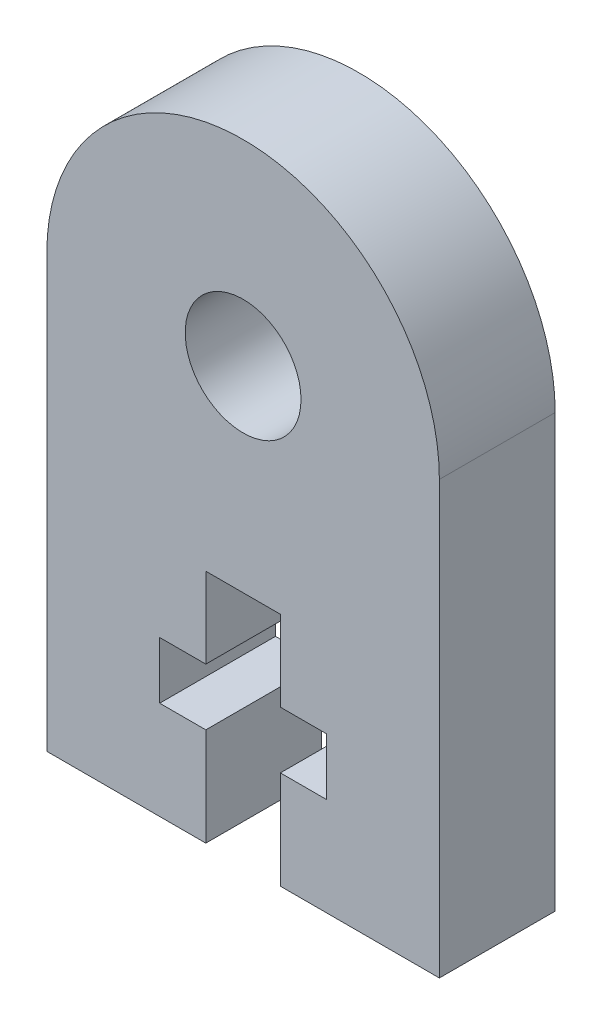
ISO-10303-21;
HEADER;
FILE_DESCRIPTION(('STEP AP214'),'2;1');
FILE_NAME('part.step','',(''),(''),'','','');
FILE_SCHEMA(('AUTOMOTIVE_DESIGN { 1 0 10303 214 1 1 1 1 }'));
ENDSEC;
DATA;
#1=APPLICATION_CONTEXT('core data for automotive mechanical design processes');
#2=APPLICATION_PROTOCOL_DEFINITION('international standard','automotive_design',2000,#1);
#3=PRODUCT_CONTEXT('',#1,'mechanical');
#4=PRODUCT('Part','Part','',(#3));
#5=PRODUCT_RELATED_PRODUCT_CATEGORY('part','',(#4));
#6=PRODUCT_DEFINITION_FORMATION('','',#4);
#7=PRODUCT_DEFINITION_CONTEXT('part definition',#1,'design');
#8=PRODUCT_DEFINITION('design','',#6,#7);
#9=PRODUCT_DEFINITION_SHAPE('','',#8);
#10=(LENGTH_UNIT() NAMED_UNIT(*) SI_UNIT(.MILLI.,.METRE.));
#11=(NAMED_UNIT(*) PLANE_ANGLE_UNIT() SI_UNIT($,.RADIAN.));
#12=(NAMED_UNIT(*) SI_UNIT($,.STERADIAN.) SOLID_ANGLE_UNIT());
#13=UNCERTAINTY_MEASURE_WITH_UNIT(LENGTH_MEASURE(1.E-05),#10,'distance_accuracy_value','');
#14=(GEOMETRIC_REPRESENTATION_CONTEXT(3) GLOBAL_UNCERTAINTY_ASSIGNED_CONTEXT((#13)) GLOBAL_UNIT_ASSIGNED_CONTEXT((#10,
#11,#12)) REPRESENTATION_CONTEXT('',''));
#15=CARTESIAN_POINT('',(0.,0.,0.));
#16=DIRECTION('',(0.,0.,1.));
#17=DIRECTION('',(1.,0.,0.));
#18=AXIS2_PLACEMENT_3D('',#15,#16,#17);
#19=CARTESIAN_POINT('',(-10.,-22.,5.9));
#20=DIRECTION('',(0.,1.,0.));
#21=DIRECTION('',(-1.,0.,0.));
#22=AXIS2_PLACEMENT_3D('',#19,#20,#21);
#23=PLANE('',#22);
#24=DIRECTION('',(1.,0.,0.));
#25=VECTOR('',#24,1.);
#26=CARTESIAN_POINT('',(-10.,-22.,0.));
#27=LINE('',#26,#25);
#28=CARTESIAN_POINT('',(-10.,-22.,0.));
#29=VERTEX_POINT('',#28);
#30=CARTESIAN_POINT('',(-1.90000000000001,-22.,0.));
#31=VERTEX_POINT('',#30);
#32=EDGE_CURVE('E173',#29,#31,#27,.T.);
#33=ORIENTED_EDGE('',*,*,#32,.T.);
#34=DIRECTION('',(0.,0.,1.));
#35=VECTOR('',#34,1.);
#36=CARTESIAN_POINT('',(-1.90000000000001,-22.,0.));
#37=LINE('',#36,#35);
#38=CARTESIAN_POINT('',(-1.90000000000001,-22.,5.9));
#39=VERTEX_POINT('',#38);
#40=EDGE_CURVE('E156',#31,#39,#37,.T.);
#41=ORIENTED_EDGE('',*,*,#40,.T.);
#42=DIRECTION('',(1.,0.,0.));
#43=VECTOR('',#42,1.);
#44=CARTESIAN_POINT('',(-10.,-22.,5.9));
#45=LINE('',#44,#43);
#46=CARTESIAN_POINT('',(-10.,-22.,5.9));
#47=VERTEX_POINT('',#46);
#48=EDGE_CURVE('E220',#47,#39,#45,.T.);
#49=ORIENTED_EDGE('',*,*,#48,.F.);
#50=DIRECTION('',(0.,0.,-1.));
#51=VECTOR('',#50,1.);
#52=CARTESIAN_POINT('',(-10.,-22.,5.9));
#53=LINE('',#52,#51);
#54=EDGE_CURVE('E178',#47,#29,#53,.T.);
#55=ORIENTED_EDGE('',*,*,#54,.T.);
#56=EDGE_LOOP('',(#33,#41,#49,#55));
#57=FACE_BOUND('',#56,.T.);
#58=ADVANCED_FACE('F33',(#57),#23,.F.);
#59=CARTESIAN_POINT('',(0.,0.,5.9));
#60=DIRECTION('',(0.,0.,-1.));
#61=DIRECTION('',(-1.,0.,0.));
#62=AXIS2_PLACEMENT_3D('',#59,#60,#61);
#63=PLANE('',#62);
#64=ORIENTED_EDGE('',*,*,#48,.T.);
#65=DIRECTION('',(0.,-1.,0.));
#66=VECTOR('',#65,1.);
#67=CARTESIAN_POINT('',(-1.90000000000001,-22.,5.9));
#68=LINE('',#67,#66);
#69=CARTESIAN_POINT('',(-1.90000000000001,-17.,5.9));
#70=VERTEX_POINT('',#69);
#71=EDGE_CURVE('E162',#70,#39,#68,.T.);
#72=ORIENTED_EDGE('',*,*,#71,.F.);
#73=DIRECTION('',(1.,0.,0.));
#74=VECTOR('',#73,1.);
#75=CARTESIAN_POINT('',(-4.25,-17.,5.9));
#76=LINE('',#75,#74);
#77=CARTESIAN_POINT('',(-4.25,-17.,5.9));
#78=VERTEX_POINT('',#77);
#79=EDGE_CURVE('E176',#78,#70,#76,.T.);
#80=ORIENTED_EDGE('',*,*,#79,.F.);
#81=DIRECTION('',(0.,-1.,0.));
#82=VECTOR('',#81,1.);
#83=CARTESIAN_POINT('',(-4.25,-14.1,5.9));
#84=LINE('',#83,#82);
#85=CARTESIAN_POINT('',(-4.25,-14.1,5.9));
#86=VERTEX_POINT('',#85);
#87=EDGE_CURVE('E255',#86,#78,#84,.T.);
#88=ORIENTED_EDGE('',*,*,#87,.F.);
#89=DIRECTION('',(-1.,0.,0.));
#90=VECTOR('',#89,1.);
#91=CARTESIAN_POINT('',(-4.25,-14.1,5.9));
#92=LINE('',#91,#90);
#93=CARTESIAN_POINT('',(-1.90000000000001,-14.1,5.9));
#94=VERTEX_POINT('',#93);
#95=EDGE_CURVE('E252',#94,#86,#92,.T.);
#96=ORIENTED_EDGE('',*,*,#95,.F.);
#97=DIRECTION('',(0.,-1.,0.));
#98=VECTOR('',#97,1.);
#99=CARTESIAN_POINT('',(-1.90000000000001,-14.1,5.9));
#100=LINE('',#99,#98);
#101=CARTESIAN_POINT('',(-1.90000000000001,-10.,5.9));
#102=VERTEX_POINT('',#101);
#103=EDGE_CURVE('E249',#102,#94,#100,.T.);
#104=ORIENTED_EDGE('',*,*,#103,.F.);
#105=DIRECTION('',(-1.,0.,0.));
#106=VECTOR('',#105,1.);
#107=CARTESIAN_POINT('',(-1.90000000000001,-10.,5.9));
#108=LINE('',#107,#106);
#109=CARTESIAN_POINT('',(1.89999999999999,-10.,5.9));
#110=VERTEX_POINT('',#109);
#111=EDGE_CURVE('E246',#110,#102,#108,.T.);
#112=ORIENTED_EDGE('',*,*,#111,.F.);
#113=DIRECTION('',(0.,1.,0.));
#114=VECTOR('',#113,1.);
#115=CARTESIAN_POINT('',(1.90000000000001,-14.1,5.9));
#116=LINE('',#115,#114);
#117=CARTESIAN_POINT('',(1.90000000000001,-14.1,5.9));
#118=VERTEX_POINT('',#117);
#119=EDGE_CURVE('E243',#118,#110,#116,.T.);
#120=ORIENTED_EDGE('',*,*,#119,.F.);
#121=DIRECTION('',(-1.,0.,0.));
#122=VECTOR('',#121,1.);
#123=CARTESIAN_POINT('',(1.90000000000001,-14.1,5.9));
#124=LINE('',#123,#122);
#125=CARTESIAN_POINT('',(4.25,-14.1,5.9));
#126=VERTEX_POINT('',#125);
#127=EDGE_CURVE('E240',#126,#118,#124,.T.);
#128=ORIENTED_EDGE('',*,*,#127,.F.);
#129=DIRECTION('',(0.,1.,0.));
#130=VECTOR('',#129,1.);
#131=CARTESIAN_POINT('',(4.25,-14.1,5.9));
#132=LINE('',#131,#130);
#133=CARTESIAN_POINT('',(4.25,-17.,5.9));
#134=VERTEX_POINT('',#133);
#135=EDGE_CURVE('E237',#134,#126,#132,.T.);
#136=ORIENTED_EDGE('',*,*,#135,.F.);
#137=DIRECTION('',(1.,0.,0.));
#138=VECTOR('',#137,1.);
#139=CARTESIAN_POINT('',(1.90000000000001,-17.,5.9));
#140=LINE('',#139,#138);
#141=CARTESIAN_POINT('',(1.90000000000001,-17.,5.9));
#142=VERTEX_POINT('',#141);
#143=EDGE_CURVE('E230',#142,#134,#140,.T.);
#144=ORIENTED_EDGE('',*,*,#143,.F.);
#145=DIRECTION('',(0.,1.,0.));
#146=VECTOR('',#145,1.);
#147=CARTESIAN_POINT('',(1.90000000000001,-22.,5.9));
#148=LINE('',#147,#146);
#149=CARTESIAN_POINT('',(1.90000000000001,-22.,5.9));
#150=VERTEX_POINT('',#149);
#151=EDGE_CURVE('E228',#150,#142,#148,.T.);
#152=ORIENTED_EDGE('',*,*,#151,.F.);
#153=CARTESIAN_POINT('',(10.,-22.,5.9));
#154=VERTEX_POINT('',#153);
#155=EDGE_CURVE('E85',#150,#154,#45,.T.);
#156=ORIENTED_EDGE('',*,*,#155,.T.);
#157=DIRECTION('',(0.,1.,0.));
#158=VECTOR('',#157,1.);
#159=CARTESIAN_POINT('',(10.,-22.,5.9));
#160=LINE('',#159,#158);
#161=CARTESIAN_POINT('',(10.,0.,5.9));
#162=VERTEX_POINT('',#161);
#163=EDGE_CURVE('E205',#154,#162,#160,.T.);
#164=ORIENTED_EDGE('',*,*,#163,.T.);
#165=CARTESIAN_POINT('',(0.,0.,5.9));
#166=DIRECTION('',(0.,0.,1.));
#167=DIRECTION('',(-1.,0.,0.));
#168=AXIS2_PLACEMENT_3D('',#165,#166,#167);
#169=CIRCLE('',#168,10.);
#170=CARTESIAN_POINT('',(-10.,0.,5.9));
#171=VERTEX_POINT('',#170);
#172=EDGE_CURVE('E199',#162,#171,#169,.T.);
#173=ORIENTED_EDGE('',*,*,#172,.T.);
#174=DIRECTION('',(0.,-1.,0.));
#175=VECTOR('',#174,1.);
#176=CARTESIAN_POINT('',(-10.,0.,5.9));
#177=LINE('',#176,#175);
#178=EDGE_CURVE('E57',#171,#47,#177,.T.);
#179=ORIENTED_EDGE('',*,*,#178,.T.);
#180=EDGE_LOOP('',(#64,#72,#80,#88,#96,#104,#112,#120,#128,#136,#144,#152,#156,#164,#173,#179));
#181=FACE_BOUND('',#180,.T.);
#182=CARTESIAN_POINT('',(0.,0.,5.9));
#183=DIRECTION('',(0.,0.,1.));
#184=DIRECTION('',(1.,0.,0.));
#185=AXIS2_PLACEMENT_3D('',#182,#183,#184);
#186=CIRCLE('',#185,2.95);
#187=CARTESIAN_POINT('',(2.95,0.,5.9));
#188=VERTEX_POINT('',#187);
#189=EDGE_CURVE('E184',#188,#188,#186,.T.);
#190=ORIENTED_EDGE('',*,*,#189,.F.);
#191=EDGE_LOOP('',(#190));
#192=FACE_BOUND('',#191,.T.);
#193=ADVANCED_FACE('F222',(#181,#192),#63,.F.);
#194=CARTESIAN_POINT('',(0.,0.,0.));
#195=DIRECTION('',(0.,0.,-1.));
#196=DIRECTION('',(-1.,0.,0.));
#197=AXIS2_PLACEMENT_3D('',#194,#195,#196);
#198=PLANE('',#197);
#199=DIRECTION('',(0.,-1.,0.));
#200=VECTOR('',#199,1.);
#201=CARTESIAN_POINT('',(-1.90000000000001,-22.,0.));
#202=LINE('',#201,#200);
#203=CARTESIAN_POINT('',(-1.90000000000001,-17.,0.));
#204=VERTEX_POINT('',#203);
#205=EDGE_CURVE('E159',#204,#31,#202,.T.);
#206=ORIENTED_EDGE('',*,*,#205,.T.);
#207=ORIENTED_EDGE('',*,*,#32,.F.);
#208=DIRECTION('',(0.,-1.,0.));
#209=VECTOR('',#208,1.);
#210=CARTESIAN_POINT('',(-10.,0.,0.));
#211=LINE('',#210,#209);
#212=CARTESIAN_POINT('',(-10.,0.,0.));
#213=VERTEX_POINT('',#212);
#214=EDGE_CURVE('E78',#213,#29,#211,.T.);
#215=ORIENTED_EDGE('',*,*,#214,.F.);
#216=CARTESIAN_POINT('',(0.,0.,0.));
#217=DIRECTION('',(0.,0.,1.));
#218=DIRECTION('',(-1.,0.,0.));
#219=AXIS2_PLACEMENT_3D('',#216,#217,#218);
#220=CIRCLE('',#219,10.);
#221=CARTESIAN_POINT('',(10.,0.,0.));
#222=VERTEX_POINT('',#221);
#223=EDGE_CURVE('E182',#222,#213,#220,.T.);
#224=ORIENTED_EDGE('',*,*,#223,.F.);
#225=DIRECTION('',(0.,1.,0.));
#226=VECTOR('',#225,1.);
#227=CARTESIAN_POINT('',(10.,-22.,0.));
#228=LINE('',#227,#226);
#229=CARTESIAN_POINT('',(10.,-22.,0.));
#230=VERTEX_POINT('',#229);
#231=EDGE_CURVE('E179',#230,#222,#228,.T.);
#232=ORIENTED_EDGE('',*,*,#231,.F.);
#233=CARTESIAN_POINT('',(1.90000000000001,-22.,0.));
#234=VERTEX_POINT('',#233);
#235=EDGE_CURVE('E180',#234,#230,#27,.T.);
#236=ORIENTED_EDGE('',*,*,#235,.F.);
#237=DIRECTION('',(0.,1.,0.));
#238=VECTOR('',#237,1.);
#239=CARTESIAN_POINT('',(1.90000000000001,-22.,0.));
#240=LINE('',#239,#238);
#241=CARTESIAN_POINT('',(1.90000000000001,-17.,0.));
#242=VERTEX_POINT('',#241);
#243=EDGE_CURVE('E48',#234,#242,#240,.T.);
#244=ORIENTED_EDGE('',*,*,#243,.T.);
#245=DIRECTION('',(1.,0.,0.));
#246=VECTOR('',#245,1.);
#247=CARTESIAN_POINT('',(1.90000000000001,-17.,0.));
#248=LINE('',#247,#246);
#249=CARTESIAN_POINT('',(4.25,-17.,0.));
#250=VERTEX_POINT('',#249);
#251=EDGE_CURVE('E296',#242,#250,#248,.T.);
#252=ORIENTED_EDGE('',*,*,#251,.T.);
#253=DIRECTION('',(0.,1.,0.));
#254=VECTOR('',#253,1.);
#255=CARTESIAN_POINT('',(4.25,-14.1,0.));
#256=LINE('',#255,#254);
#257=CARTESIAN_POINT('',(4.25,-14.1,0.));
#258=VERTEX_POINT('',#257);
#259=EDGE_CURVE('E279',#250,#258,#256,.T.);
#260=ORIENTED_EDGE('',*,*,#259,.T.);
#261=DIRECTION('',(-1.,0.,0.));
#262=VECTOR('',#261,1.);
#263=CARTESIAN_POINT('',(1.90000000000001,-14.1,0.));
#264=LINE('',#263,#262);
#265=CARTESIAN_POINT('',(1.90000000000001,-14.1,0.));
#266=VERTEX_POINT('',#265);
#267=EDGE_CURVE('E292',#258,#266,#264,.T.);
#268=ORIENTED_EDGE('',*,*,#267,.T.);
#269=DIRECTION('',(0.,1.,0.));
#270=VECTOR('',#269,1.);
#271=CARTESIAN_POINT('',(1.90000000000001,-14.1,0.));
#272=LINE('',#271,#270);
#273=CARTESIAN_POINT('',(1.89999999999999,-10.,0.));
#274=VERTEX_POINT('',#273);
#275=EDGE_CURVE('E294',#266,#274,#272,.T.);
#276=ORIENTED_EDGE('',*,*,#275,.T.);
#277=DIRECTION('',(-1.,0.,0.));
#278=VECTOR('',#277,1.);
#279=CARTESIAN_POINT('',(-1.90000000000001,-10.,0.));
#280=LINE('',#279,#278);
#281=CARTESIAN_POINT('',(-1.90000000000001,-10.,0.));
#282=VERTEX_POINT('',#281);
#283=EDGE_CURVE('E302',#274,#282,#280,.T.);
#284=ORIENTED_EDGE('',*,*,#283,.T.);
#285=DIRECTION('',(0.,-1.,0.));
#286=VECTOR('',#285,1.);
#287=CARTESIAN_POINT('',(-1.90000000000001,-14.1,0.));
#288=LINE('',#287,#286);
#289=CARTESIAN_POINT('',(-1.90000000000001,-14.1,0.));
#290=VERTEX_POINT('',#289);
#291=EDGE_CURVE('E305',#282,#290,#288,.T.);
#292=ORIENTED_EDGE('',*,*,#291,.T.);
#293=DIRECTION('',(-1.,0.,0.));
#294=VECTOR('',#293,1.);
#295=CARTESIAN_POINT('',(-4.25,-14.1,0.));
#296=LINE('',#295,#294);
#297=CARTESIAN_POINT('',(-4.25,-14.1,0.));
#298=VERTEX_POINT('',#297);
#299=EDGE_CURVE('E308',#290,#298,#296,.T.);
#300=ORIENTED_EDGE('',*,*,#299,.T.);
#301=DIRECTION('',(0.,-1.,0.));
#302=VECTOR('',#301,1.);
#303=CARTESIAN_POINT('',(-4.25,-14.1,0.));
#304=LINE('',#303,#302);
#305=CARTESIAN_POINT('',(-4.25,-17.,0.));
#306=VERTEX_POINT('',#305);
#307=EDGE_CURVE('E310',#298,#306,#304,.T.);
#308=ORIENTED_EDGE('',*,*,#307,.T.);
#309=DIRECTION('',(1.,0.,0.));
#310=VECTOR('',#309,1.);
#311=CARTESIAN_POINT('',(-4.25,-17.,0.));
#312=LINE('',#311,#310);
#313=EDGE_CURVE('E167',#306,#204,#312,.T.);
#314=ORIENTED_EDGE('',*,*,#313,.T.);
#315=EDGE_LOOP('',(#206,#207,#215,#224,#232,#236,#244,#252,#260,#268,#276,#284,#292,#300,#308,#314));
#316=FACE_BOUND('',#315,.T.);
#317=CARTESIAN_POINT('',(0.,0.,0.));
#318=DIRECTION('',(0.,0.,1.));
#319=DIRECTION('',(1.,0.,0.));
#320=AXIS2_PLACEMENT_3D('',#317,#318,#319);
#321=CIRCLE('',#320,2.95);
#322=CARTESIAN_POINT('',(2.95,0.,0.));
#323=VERTEX_POINT('',#322);
#324=EDGE_CURVE('E216',#323,#323,#321,.T.);
#325=ORIENTED_EDGE('',*,*,#324,.T.);
#326=EDGE_LOOP('',(#325));
#327=FACE_BOUND('',#326,.T.);
#328=ADVANCED_FACE('F171',(#316,#327),#198,.T.);
#329=ORIENTED_EDGE('',*,*,#155,.F.);
#330=DIRECTION('',(0.,0.,1.));
#331=VECTOR('',#330,1.);
#332=CARTESIAN_POINT('',(1.90000000000001,-22.,0.));
#333=LINE('',#332,#331);
#334=EDGE_CURVE('E166',#234,#150,#333,.T.);
#335=ORIENTED_EDGE('',*,*,#334,.F.);
#336=ORIENTED_EDGE('',*,*,#235,.T.);
#337=DIRECTION('',(0.,0.,-1.));
#338=VECTOR('',#337,1.);
#339=CARTESIAN_POINT('',(10.,-22.,5.9));
#340=LINE('',#339,#338);
#341=EDGE_CURVE('E11',#154,#230,#340,.T.);
#342=ORIENTED_EDGE('',*,*,#341,.F.);
#343=EDGE_LOOP('',(#329,#335,#336,#342));
#344=FACE_BOUND('',#343,.T.);
#345=ADVANCED_FACE('F35',(#344),#23,.F.);
#346=CARTESIAN_POINT('',(10.,-22.,5.9));
#347=DIRECTION('',(-1.,0.,0.));
#348=DIRECTION('',(0.,-1.,0.));
#349=AXIS2_PLACEMENT_3D('',#346,#347,#348);
#350=PLANE('',#349);
#351=ORIENTED_EDGE('',*,*,#231,.T.);
#352=DIRECTION('',(0.,0.,-1.));
#353=VECTOR('',#352,1.);
#354=CARTESIAN_POINT('',(10.,0.,5.9));
#355=LINE('',#354,#353);
#356=EDGE_CURVE('E41',#162,#222,#355,.T.);
#357=ORIENTED_EDGE('',*,*,#356,.F.);
#358=ORIENTED_EDGE('',*,*,#163,.F.);
#359=ORIENTED_EDGE('',*,*,#341,.T.);
#360=EDGE_LOOP('',(#351,#357,#358,#359));
#361=FACE_BOUND('',#360,.T.);
#362=ADVANCED_FACE('F204',(#361),#350,.F.);
#363=CARTESIAN_POINT('',(0.,0.,5.9));
#364=DIRECTION('',(0.,0.,-1.));
#365=DIRECTION('',(-1.,0.,0.));
#366=AXIS2_PLACEMENT_3D('',#363,#364,#365);
#367=CYLINDRICAL_SURFACE('',#366,10.);
#368=ORIENTED_EDGE('',*,*,#223,.T.);
#369=DIRECTION('',(0.,0.,-1.));
#370=VECTOR('',#369,1.);
#371=CARTESIAN_POINT('',(-10.,0.,5.9));
#372=LINE('',#371,#370);
#373=EDGE_CURVE('E191',#171,#213,#372,.T.);
#374=ORIENTED_EDGE('',*,*,#373,.F.);
#375=ORIENTED_EDGE('',*,*,#172,.F.);
#376=ORIENTED_EDGE('',*,*,#356,.T.);
#377=EDGE_LOOP('',(#368,#374,#375,#376));
#378=FACE_BOUND('',#377,.T.);
#379=ADVANCED_FACE('F197',(#378),#367,.T.);
#380=CARTESIAN_POINT('',(-10.,0.,5.9));
#381=DIRECTION('',(1.,0.,0.));
#382=DIRECTION('',(0.,1.,0.));
#383=AXIS2_PLACEMENT_3D('',#380,#381,#382);
#384=PLANE('',#383);
#385=ORIENTED_EDGE('',*,*,#214,.T.);
#386=ORIENTED_EDGE('',*,*,#54,.F.);
#387=ORIENTED_EDGE('',*,*,#178,.F.);
#388=ORIENTED_EDGE('',*,*,#373,.T.);
#389=EDGE_LOOP('',(#385,#386,#387,#388));
#390=FACE_BOUND('',#389,.T.);
#391=ADVANCED_FACE('F224',(#390),#384,.F.);
#392=CARTESIAN_POINT('',(0.,0.,5.9));
#393=DIRECTION('',(0.,0.,-1.));
#394=DIRECTION('',(-1.,0.,0.));
#395=AXIS2_PLACEMENT_3D('',#392,#393,#394);
#396=CYLINDRICAL_SURFACE('',#395,2.95);
#397=ORIENTED_EDGE('',*,*,#189,.T.);
#398=EDGE_LOOP('',(#397));
#399=FACE_BOUND('',#398,.T.);
#400=ORIENTED_EDGE('',*,*,#324,.F.);
#401=EDGE_LOOP('',(#400));
#402=FACE_BOUND('',#401,.T.);
#403=ADVANCED_FACE('F325',(#399,#402),#396,.F.);
#404=CARTESIAN_POINT('',(-1.90000000000001,-22.,0.));
#405=DIRECTION('',(-1.,0.,0.));
#406=DIRECTION('',(0.,-1.,0.));
#407=AXIS2_PLACEMENT_3D('',#404,#405,#406);
#408=PLANE('',#407);
#409=ORIENTED_EDGE('',*,*,#71,.T.);
#410=ORIENTED_EDGE('',*,*,#40,.F.);
#411=ORIENTED_EDGE('',*,*,#205,.F.);
#412=DIRECTION('',(0.,0.,1.));
#413=VECTOR('',#412,1.);
#414=CARTESIAN_POINT('',(-1.90000000000001,-17.,0.));
#415=LINE('',#414,#413);
#416=EDGE_CURVE('E219',#204,#70,#415,.T.);
#417=ORIENTED_EDGE('',*,*,#416,.T.);
#418=EDGE_LOOP('',(#409,#410,#411,#417));
#419=FACE_BOUND('',#418,.T.);
#420=ADVANCED_FACE('F158',(#419),#408,.F.);
#421=CARTESIAN_POINT('',(-4.25,-17.,0.));
#422=DIRECTION('',(0.,-1.,0.));
#423=DIRECTION('',(0.,0.,-1.));
#424=AXIS2_PLACEMENT_3D('',#421,#422,#423);
#425=PLANE('',#424);
#426=ORIENTED_EDGE('',*,*,#79,.T.);
#427=ORIENTED_EDGE('',*,*,#416,.F.);
#428=ORIENTED_EDGE('',*,*,#313,.F.);
#429=DIRECTION('',(0.,0.,1.));
#430=VECTOR('',#429,1.);
#431=CARTESIAN_POINT('',(-4.25,-17.,0.));
#432=LINE('',#431,#430);
#433=EDGE_CURVE('E260',#306,#78,#432,.T.);
#434=ORIENTED_EDGE('',*,*,#433,.T.);
#435=EDGE_LOOP('',(#426,#427,#428,#434));
#436=FACE_BOUND('',#435,.T.);
#437=ADVANCED_FACE('F316',(#436),#425,.F.);
#438=CARTESIAN_POINT('',(-4.25,-14.1,0.));
#439=DIRECTION('',(-1.,0.,0.));
#440=DIRECTION('',(0.,-1.,0.));
#441=AXIS2_PLACEMENT_3D('',#438,#439,#440);
#442=PLANE('',#441);
#443=ORIENTED_EDGE('',*,*,#87,.T.);
#444=ORIENTED_EDGE('',*,*,#433,.F.);
#445=ORIENTED_EDGE('',*,*,#307,.F.);
#446=DIRECTION('',(0.,0.,1.));
#447=VECTOR('',#446,1.);
#448=CARTESIAN_POINT('',(-4.25,-14.1,0.));
#449=LINE('',#448,#447);
#450=EDGE_CURVE('E262',#298,#86,#449,.T.);
#451=ORIENTED_EDGE('',*,*,#450,.T.);
#452=EDGE_LOOP('',(#443,#444,#445,#451));
#453=FACE_BOUND('',#452,.T.);
#454=ADVANCED_FACE('F314',(#453),#442,.F.);
#455=CARTESIAN_POINT('',(-4.25,-14.1,0.));
#456=DIRECTION('',(0.,1.,0.));
#457=DIRECTION('',(0.,0.,1.));
#458=AXIS2_PLACEMENT_3D('',#455,#456,#457);
#459=PLANE('',#458);
#460=ORIENTED_EDGE('',*,*,#95,.T.);
#461=ORIENTED_EDGE('',*,*,#450,.F.);
#462=ORIENTED_EDGE('',*,*,#299,.F.);
#463=DIRECTION('',(0.,0.,1.));
#464=VECTOR('',#463,1.);
#465=CARTESIAN_POINT('',(-1.90000000000001,-14.1,0.));
#466=LINE('',#465,#464);
#467=EDGE_CURVE('E264',#290,#94,#466,.T.);
#468=ORIENTED_EDGE('',*,*,#467,.T.);
#469=EDGE_LOOP('',(#460,#461,#462,#468));
#470=FACE_BOUND('',#469,.T.);
#471=ADVANCED_FACE('F323',(#470),#459,.F.);
#472=CARTESIAN_POINT('',(-1.90000000000001,-14.1,0.));
#473=DIRECTION('',(-1.,0.,0.));
#474=DIRECTION('',(0.,0.,1.));
#475=AXIS2_PLACEMENT_3D('',#472,#473,#474);
#476=PLANE('',#475);
#477=ORIENTED_EDGE('',*,*,#103,.T.);
#478=ORIENTED_EDGE('',*,*,#467,.F.);
#479=ORIENTED_EDGE('',*,*,#291,.F.);
#480=DIRECTION('',(0.,0.,1.));
#481=VECTOR('',#480,1.);
#482=CARTESIAN_POINT('',(-1.90000000000001,-10.,0.));
#483=LINE('',#482,#481);
#484=EDGE_CURVE('E266',#282,#102,#483,.T.);
#485=ORIENTED_EDGE('',*,*,#484,.T.);
#486=EDGE_LOOP('',(#477,#478,#479,#485));
#487=FACE_BOUND('',#486,.T.);
#488=ADVANCED_FACE('F385',(#487),#476,.F.);
#489=CARTESIAN_POINT('',(-1.90000000000001,-10.,0.));
#490=DIRECTION('',(0.,1.,0.));
#491=DIRECTION('',(0.,0.,1.));
#492=AXIS2_PLACEMENT_3D('',#489,#490,#491);
#493=PLANE('',#492);
#494=ORIENTED_EDGE('',*,*,#111,.T.);
#495=ORIENTED_EDGE('',*,*,#484,.F.);
#496=ORIENTED_EDGE('',*,*,#283,.F.);
#497=DIRECTION('',(0.,0.,1.));
#498=VECTOR('',#497,1.);
#499=CARTESIAN_POINT('',(1.89999999999999,-10.,0.));
#500=LINE('',#499,#498);
#501=EDGE_CURVE('E268',#274,#110,#500,.T.);
#502=ORIENTED_EDGE('',*,*,#501,.T.);
#503=EDGE_LOOP('',(#494,#495,#496,#502));
#504=FACE_BOUND('',#503,.T.);
#505=ADVANCED_FACE('F395',(#504),#493,.F.);
#506=CARTESIAN_POINT('',(1.90000000000001,-14.1,0.));
#507=DIRECTION('',(1.,0.,0.));
#508=DIRECTION('',(0.,1.,0.));
#509=AXIS2_PLACEMENT_3D('',#506,#507,#508);
#510=PLANE('',#509);
#511=ORIENTED_EDGE('',*,*,#119,.T.);
#512=ORIENTED_EDGE('',*,*,#501,.F.);
#513=ORIENTED_EDGE('',*,*,#275,.F.);
#514=DIRECTION('',(0.,0.,1.));
#515=VECTOR('',#514,1.);
#516=CARTESIAN_POINT('',(1.90000000000001,-14.1,0.));
#517=LINE('',#516,#515);
#518=EDGE_CURVE('E270',#266,#118,#517,.T.);
#519=ORIENTED_EDGE('',*,*,#518,.T.);
#520=EDGE_LOOP('',(#511,#512,#513,#519));
#521=FACE_BOUND('',#520,.T.);
#522=ADVANCED_FACE('F405',(#521),#510,.F.);
#523=CARTESIAN_POINT('',(1.90000000000001,-14.1,0.));
#524=DIRECTION('',(0.,1.,0.));
#525=DIRECTION('',(0.,0.,1.));
#526=AXIS2_PLACEMENT_3D('',#523,#524,#525);
#527=PLANE('',#526);
#528=ORIENTED_EDGE('',*,*,#127,.T.);
#529=ORIENTED_EDGE('',*,*,#518,.F.);
#530=ORIENTED_EDGE('',*,*,#267,.F.);
#531=DIRECTION('',(0.,0.,1.));
#532=VECTOR('',#531,1.);
#533=CARTESIAN_POINT('',(4.25,-14.1,0.));
#534=LINE('',#533,#532);
#535=EDGE_CURVE('E272',#258,#126,#534,.T.);
#536=ORIENTED_EDGE('',*,*,#535,.T.);
#537=EDGE_LOOP('',(#528,#529,#530,#536));
#538=FACE_BOUND('',#537,.T.);
#539=ADVANCED_FACE('F288',(#538),#527,.F.);
#540=CARTESIAN_POINT('',(4.25,-14.1,0.));
#541=DIRECTION('',(1.,0.,0.));
#542=DIRECTION('',(0.,1.,0.));
#543=AXIS2_PLACEMENT_3D('',#540,#541,#542);
#544=PLANE('',#543);
#545=ORIENTED_EDGE('',*,*,#135,.T.);
#546=ORIENTED_EDGE('',*,*,#535,.F.);
#547=ORIENTED_EDGE('',*,*,#259,.F.);
#548=DIRECTION('',(0.,0.,1.));
#549=VECTOR('',#548,1.);
#550=CARTESIAN_POINT('',(4.25,-17.,0.));
#551=LINE('',#550,#549);
#552=EDGE_CURVE('E210',#250,#134,#551,.T.);
#553=ORIENTED_EDGE('',*,*,#552,.T.);
#554=EDGE_LOOP('',(#545,#546,#547,#553));
#555=FACE_BOUND('',#554,.T.);
#556=ADVANCED_FACE('F275',(#555),#544,.F.);
#557=CARTESIAN_POINT('',(1.90000000000001,-17.,0.));
#558=DIRECTION('',(0.,-1.,0.));
#559=DIRECTION('',(0.,0.,-1.));
#560=AXIS2_PLACEMENT_3D('',#557,#558,#559);
#561=PLANE('',#560);
#562=ORIENTED_EDGE('',*,*,#143,.T.);
#563=ORIENTED_EDGE('',*,*,#552,.F.);
#564=ORIENTED_EDGE('',*,*,#251,.F.);
#565=DIRECTION('',(0.,0.,1.));
#566=VECTOR('',#565,1.);
#567=CARTESIAN_POINT('',(1.90000000000001,-17.,0.));
#568=LINE('',#567,#566);
#569=EDGE_CURVE('E208',#242,#142,#568,.T.);
#570=ORIENTED_EDGE('',*,*,#569,.T.);
#571=EDGE_LOOP('',(#562,#563,#564,#570));
#572=FACE_BOUND('',#571,.T.);
#573=ADVANCED_FACE('F284',(#572),#561,.F.);
#574=CARTESIAN_POINT('',(1.90000000000001,-22.,0.));
#575=DIRECTION('',(1.,0.,0.));
#576=DIRECTION('',(0.,1.,0.));
#577=AXIS2_PLACEMENT_3D('',#574,#575,#576);
#578=PLANE('',#577);
#579=ORIENTED_EDGE('',*,*,#151,.T.);
#580=ORIENTED_EDGE('',*,*,#569,.F.);
#581=ORIENTED_EDGE('',*,*,#243,.F.);
#582=ORIENTED_EDGE('',*,*,#334,.T.);
#583=EDGE_LOOP('',(#579,#580,#581,#582));
#584=FACE_BOUND('',#583,.T.);
#585=ADVANCED_FACE('F440',(#584),#578,.F.);
#586=CLOSED_SHELL('',(#58,#193,#328,#345,#362,#379,#391,#403,#420,#437,#454,#471,#488,#505,#522,
#539,#556,#573,#585));
#587=MANIFOLD_SOLID_BREP('B2',#586);
#588=ADVANCED_BREP_SHAPE_REPRESENTATION('',(#18,#587),#14);
#589=SHAPE_DEFINITION_REPRESENTATION(#9,#588);
ENDSEC;
END-ISO-10303-21;
